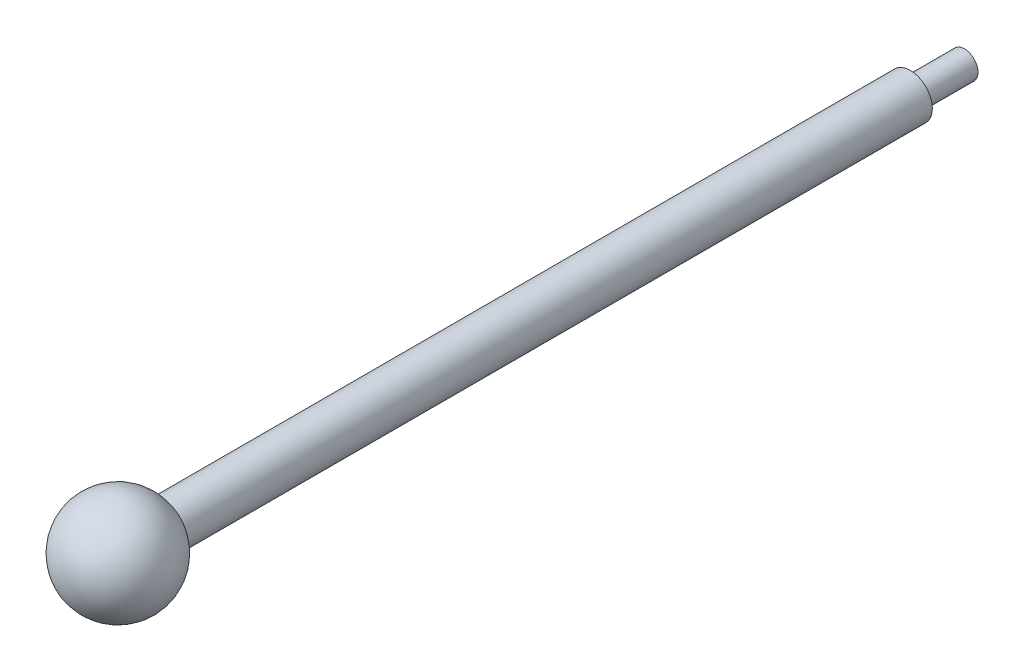
ISO-10303-21;
HEADER;
FILE_DESCRIPTION(('STEP AP214'),'2;1');
FILE_NAME('part.step','',(''),(''),'','','');
FILE_SCHEMA(('AUTOMOTIVE_DESIGN { 1 0 10303 214 1 1 1 1 }'));
ENDSEC;
DATA;
#1=APPLICATION_CONTEXT('core data for automotive mechanical design processes');
#2=APPLICATION_PROTOCOL_DEFINITION('international standard','automotive_design',2000,#1);
#3=PRODUCT_CONTEXT('',#1,'mechanical');
#4=PRODUCT('Part','Part','',(#3));
#5=PRODUCT_RELATED_PRODUCT_CATEGORY('part','',(#4));
#6=PRODUCT_DEFINITION_FORMATION('','',#4);
#7=PRODUCT_DEFINITION_CONTEXT('part definition',#1,'design');
#8=PRODUCT_DEFINITION('design','',#6,#7);
#9=PRODUCT_DEFINITION_SHAPE('','',#8);
#10=(LENGTH_UNIT() NAMED_UNIT(*) SI_UNIT(.MILLI.,.METRE.));
#11=(NAMED_UNIT(*) PLANE_ANGLE_UNIT() SI_UNIT($,.RADIAN.));
#12=(NAMED_UNIT(*) SI_UNIT($,.STERADIAN.) SOLID_ANGLE_UNIT());
#13=UNCERTAINTY_MEASURE_WITH_UNIT(LENGTH_MEASURE(1.E-05),#10,'distance_accuracy_value','');
#14=(GEOMETRIC_REPRESENTATION_CONTEXT(3) GLOBAL_UNCERTAINTY_ASSIGNED_CONTEXT((#13)) GLOBAL_UNIT_ASSIGNED_CONTEXT((#10,
#11,#12)) REPRESENTATION_CONTEXT('',''));
#15=CARTESIAN_POINT('',(0.,0.,0.));
#16=DIRECTION('',(0.,0.,1.));
#17=DIRECTION('',(1.,0.,0.));
#18=AXIS2_PLACEMENT_3D('',#15,#16,#17);
#19=CARTESIAN_POINT('',(0.,0.,0.));
#20=DIRECTION('',(0.,1.,0.));
#21=DIRECTION('',(1.,0.,0.));
#22=AXIS2_PLACEMENT_3D('',#19,#20,#21);
#23=SPHERICAL_SURFACE('',#22,15.);
#24=CARTESIAN_POINT('',(0.,0.,0.));
#25=DIRECTION('',(0.,0.,1.));
#26=DIRECTION('',(1.,0.,0.));
#27=AXIS2_PLACEMENT_3D('',#24,#25,#26);
#28=SPHERICAL_SURFACE('',#27,15.);
#29=CARTESIAN_POINT('',(0.,0.,-13.5185058345958));
#30=DIRECTION('',(0.,0.,1.));
#31=DIRECTION('',(1.,0.,0.));
#32=AXIS2_PLACEMENT_3D('',#29,#30,#31);
#33=CIRCLE('',#32,6.5);
#34=CARTESIAN_POINT('',(6.5,0.,-13.5185058345958));
#35=VERTEX_POINT('',#34);
#36=EDGE_CURVE('E40',#35,#35,#33,.F.);
#37=ORIENTED_EDGE('',*,*,#36,.F.);
#38=EDGE_LOOP('',(#37));
#39=FACE_BOUND('',#38,.T.);
#40=ADVANCED_FACE('F37',(#39),#28,.T.);
#41=CARTESIAN_POINT('',(0.,0.,15.002));
#42=DIRECTION('',(0.,0.,-1.));
#43=DIRECTION('',(-1.,0.,0.));
#44=AXIS2_PLACEMENT_3D('',#41,#42,#43);
#45=CYLINDRICAL_SURFACE('',#44,6.5);
#46=ORIENTED_EDGE('',*,*,#36,.T.);
#47=EDGE_LOOP('',(#46));
#48=FACE_BOUND('',#47,.T.);
#49=CARTESIAN_POINT('',(0.,0.,-234.));
#50=DIRECTION('',(0.,0.,-1.));
#51=DIRECTION('',(-1.,0.,0.));
#52=AXIS2_PLACEMENT_3D('',#49,#50,#51);
#53=CIRCLE('',#52,6.5);
#54=CARTESIAN_POINT('',(-6.5,0.,-234.));
#55=VERTEX_POINT('',#54);
#56=EDGE_CURVE('E50',#55,#55,#53,.T.);
#57=ORIENTED_EDGE('',*,*,#56,.F.);
#58=EDGE_LOOP('',(#57));
#59=FACE_BOUND('',#58,.T.);
#60=ADVANCED_FACE('F72',(#48,#59),#45,.T.);
#61=CARTESIAN_POINT('',(0.,0.,-234.));
#62=DIRECTION('',(0.,0.,-1.));
#63=DIRECTION('',(-1.,0.,0.));
#64=AXIS2_PLACEMENT_3D('',#61,#62,#63);
#65=PLANE('',#64);
#66=CARTESIAN_POINT('',(0.,0.,-234.));
#67=DIRECTION('',(0.,0.,-1.));
#68=DIRECTION('',(-1.,0.,0.));
#69=AXIS2_PLACEMENT_3D('',#66,#67,#68);
#70=CIRCLE('',#69,4.);
#71=CARTESIAN_POINT('',(-4.,0.,-234.));
#72=VERTEX_POINT('',#71);
#73=EDGE_CURVE('E10',#72,#72,#70,.T.);
#74=ORIENTED_EDGE('',*,*,#73,.F.);
#75=EDGE_LOOP('',(#74));
#76=FACE_BOUND('',#75,.T.);
#77=ORIENTED_EDGE('',*,*,#56,.T.);
#78=EDGE_LOOP('',(#77));
#79=FACE_BOUND('',#78,.T.);
#80=ADVANCED_FACE('F65',(#76,#79),#65,.T.);
#81=CARTESIAN_POINT('',(0.,0.,-250.));
#82=DIRECTION('',(0.,0.,1.));
#83=DIRECTION('',(1.,0.,0.));
#84=AXIS2_PLACEMENT_3D('',#81,#82,#83);
#85=CYLINDRICAL_SURFACE('',#84,4.);
#86=CARTESIAN_POINT('',(0.,0.,-250.));
#87=DIRECTION('',(0.,0.,-1.));
#88=DIRECTION('',(-1.,0.,0.));
#89=AXIS2_PLACEMENT_3D('',#86,#87,#88);
#90=CIRCLE('',#89,4.);
#91=CARTESIAN_POINT('',(-4.,0.,-250.));
#92=VERTEX_POINT('',#91);
#93=EDGE_CURVE('E52',#92,#92,#90,.T.);
#94=ORIENTED_EDGE('',*,*,#93,.F.);
#95=EDGE_LOOP('',(#94));
#96=FACE_BOUND('',#95,.T.);
#97=ORIENTED_EDGE('',*,*,#73,.T.);
#98=EDGE_LOOP('',(#97));
#99=FACE_BOUND('',#98,.T.);
#100=ADVANCED_FACE('F63',(#96,#99),#85,.T.);
#101=CARTESIAN_POINT('',(0.,0.,-250.));
#102=DIRECTION('',(0.,0.,-1.));
#103=DIRECTION('',(-1.,0.,0.));
#104=AXIS2_PLACEMENT_3D('',#101,#102,#103);
#105=PLANE('',#104);
#106=ORIENTED_EDGE('',*,*,#93,.T.);
#107=EDGE_LOOP('',(#106));
#108=FACE_BOUND('',#107,.T.);
#109=ADVANCED_FACE('F61',(#108),#105,.T.);
#110=CLOSED_SHELL('',(#40,#60,#80,#100,#109));
#111=MANIFOLD_SOLID_BREP('B2',#110);
#112=ADVANCED_BREP_SHAPE_REPRESENTATION('',(#18,#111),#14);
#113=SHAPE_DEFINITION_REPRESENTATION(#9,#112);
ENDSEC;
END-ISO-10303-21;
